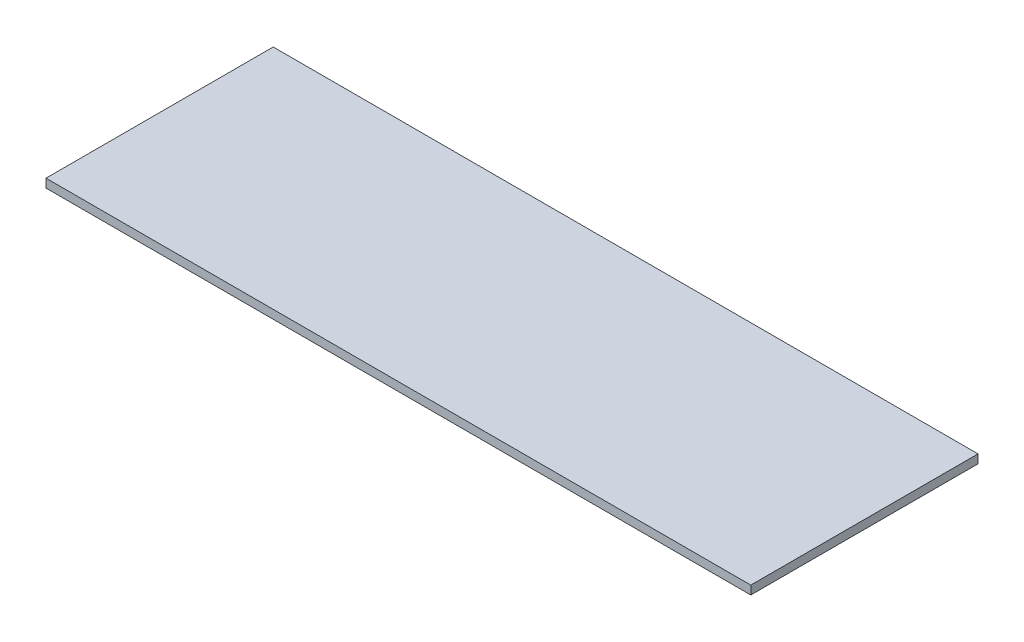
ISO-10303-21;
HEADER;
FILE_DESCRIPTION(('STEP AP214'),'2;1');
FILE_NAME('part.step','',(''),(''),'','','');
FILE_SCHEMA(('AUTOMOTIVE_DESIGN { 1 0 10303 214 1 1 1 1 }'));
ENDSEC;
DATA;
#1=APPLICATION_CONTEXT('core data for automotive mechanical design processes');
#2=APPLICATION_PROTOCOL_DEFINITION('international standard','automotive_design',2000,#1);
#3=PRODUCT_CONTEXT('',#1,'mechanical');
#4=PRODUCT('Part','Part','',(#3));
#5=PRODUCT_RELATED_PRODUCT_CATEGORY('part','',(#4));
#6=PRODUCT_DEFINITION_FORMATION('','',#4);
#7=PRODUCT_DEFINITION_CONTEXT('part definition',#1,'design');
#8=PRODUCT_DEFINITION('design','',#6,#7);
#9=PRODUCT_DEFINITION_SHAPE('','',#8);
#10=(LENGTH_UNIT() NAMED_UNIT(*) SI_UNIT(.MILLI.,.METRE.));
#11=(NAMED_UNIT(*) PLANE_ANGLE_UNIT() SI_UNIT($,.RADIAN.));
#12=(NAMED_UNIT(*) SI_UNIT($,.STERADIAN.) SOLID_ANGLE_UNIT());
#13=UNCERTAINTY_MEASURE_WITH_UNIT(LENGTH_MEASURE(1.E-05),#10,'distance_accuracy_value','');
#14=(GEOMETRIC_REPRESENTATION_CONTEXT(3) GLOBAL_UNCERTAINTY_ASSIGNED_CONTEXT((#13)) GLOBAL_UNIT_ASSIGNED_CONTEXT((#10,
#11,#12)) REPRESENTATION_CONTEXT('',''));
#15=CARTESIAN_POINT('',(0.,0.,0.));
#16=DIRECTION('',(0.,0.,1.));
#17=DIRECTION('',(1.,0.,0.));
#18=AXIS2_PLACEMENT_3D('',#15,#16,#17);
#19=CARTESIAN_POINT('',(167.5,4.09516548284806,-54.));
#20=DIRECTION('',(-1.,0.,0.));
#21=DIRECTION('',(0.,0.,1.));
#22=AXIS2_PLACEMENT_3D('',#19,#20,#21);
#23=PLANE('',#22);
#24=DIRECTION('',(0.,0.,-1.));
#25=VECTOR('',#24,1.);
#26=CARTESIAN_POINT('',(167.5,0.,-54.));
#27=LINE('',#26,#25);
#28=CARTESIAN_POINT('',(167.5,0.,54.));
#29=VERTEX_POINT('',#28);
#30=CARTESIAN_POINT('',(167.5,0.,-54.));
#31=VERTEX_POINT('',#30);
#32=EDGE_CURVE('E96',#29,#31,#27,.T.);
#33=ORIENTED_EDGE('',*,*,#32,.T.);
#34=DIRECTION('',(0.,-1.,0.));
#35=VECTOR('',#34,1.);
#36=CARTESIAN_POINT('',(167.5,4.09516548284806,-54.));
#37=LINE('',#36,#35);
#38=CARTESIAN_POINT('',(167.5,4.09516548284806,-54.));
#39=VERTEX_POINT('',#38);
#40=EDGE_CURVE('E11',#39,#31,#37,.T.);
#41=ORIENTED_EDGE('',*,*,#40,.F.);
#42=DIRECTION('',(0.,0.,-1.));
#43=VECTOR('',#42,1.);
#44=CARTESIAN_POINT('',(167.5,4.09516548284806,-54.));
#45=LINE('',#44,#43);
#46=CARTESIAN_POINT('',(167.5,4.09516548284806,54.));
#47=VERTEX_POINT('',#46);
#48=EDGE_CURVE('E84',#47,#39,#45,.T.);
#49=ORIENTED_EDGE('',*,*,#48,.F.);
#50=DIRECTION('',(0.,-1.,0.));
#51=VECTOR('',#50,1.);
#52=CARTESIAN_POINT('',(167.5,4.09516548284806,54.));
#53=LINE('',#52,#51);
#54=EDGE_CURVE('E92',#47,#29,#53,.T.);
#55=ORIENTED_EDGE('',*,*,#54,.T.);
#56=EDGE_LOOP('',(#33,#41,#49,#55));
#57=FACE_BOUND('',#56,.T.);
#58=ADVANCED_FACE('F33',(#57),#23,.F.);
#59=CARTESIAN_POINT('',(-167.5,4.09516548284806,-54.));
#60=DIRECTION('',(0.,0.,1.));
#61=DIRECTION('',(1.,0.,0.));
#62=AXIS2_PLACEMENT_3D('',#59,#60,#61);
#63=PLANE('',#62);
#64=DIRECTION('',(-1.,0.,0.));
#65=VECTOR('',#64,1.);
#66=CARTESIAN_POINT('',(-167.5,0.,-54.));
#67=LINE('',#66,#65);
#68=CARTESIAN_POINT('',(-167.5,0.,-54.));
#69=VERTEX_POINT('',#68);
#70=EDGE_CURVE('E88',#31,#69,#67,.T.);
#71=ORIENTED_EDGE('',*,*,#70,.T.);
#72=DIRECTION('',(0.,-1.,0.));
#73=VECTOR('',#72,1.);
#74=CARTESIAN_POINT('',(-167.5,4.09516548284806,-54.));
#75=LINE('',#74,#73);
#76=CARTESIAN_POINT('',(-167.5,4.09516548284806,-54.));
#77=VERTEX_POINT('',#76);
#78=EDGE_CURVE('E41',#77,#69,#75,.T.);
#79=ORIENTED_EDGE('',*,*,#78,.F.);
#80=DIRECTION('',(-1.,0.,0.));
#81=VECTOR('',#80,1.);
#82=CARTESIAN_POINT('',(-167.5,4.09516548284806,-54.));
#83=LINE('',#82,#81);
#84=EDGE_CURVE('E79',#39,#77,#83,.T.);
#85=ORIENTED_EDGE('',*,*,#84,.F.);
#86=ORIENTED_EDGE('',*,*,#40,.T.);
#87=EDGE_LOOP('',(#71,#79,#85,#86));
#88=FACE_BOUND('',#87,.T.);
#89=ADVANCED_FACE('F87',(#88),#63,.F.);
#90=CARTESIAN_POINT('',(-167.5,4.09516548284806,-54.));
#91=DIRECTION('',(1.,0.,0.));
#92=DIRECTION('',(0.,0.,-1.));
#93=AXIS2_PLACEMENT_3D('',#90,#91,#92);
#94=PLANE('',#93);
#95=DIRECTION('',(0.,0.,1.));
#96=VECTOR('',#95,1.);
#97=CARTESIAN_POINT('',(-167.5,0.,-54.));
#98=LINE('',#97,#96);
#99=CARTESIAN_POINT('',(-167.5,0.,54.));
#100=VERTEX_POINT('',#99);
#101=EDGE_CURVE('E66',#69,#100,#98,.T.);
#102=ORIENTED_EDGE('',*,*,#101,.T.);
#103=DIRECTION('',(0.,-1.,0.));
#104=VECTOR('',#103,1.);
#105=CARTESIAN_POINT('',(-167.5,4.09516548284806,54.));
#106=LINE('',#105,#104);
#107=CARTESIAN_POINT('',(-167.5,4.09516548284806,54.));
#108=VERTEX_POINT('',#107);
#109=EDGE_CURVE('E89',#108,#100,#106,.T.);
#110=ORIENTED_EDGE('',*,*,#109,.F.);
#111=DIRECTION('',(0.,0.,1.));
#112=VECTOR('',#111,1.);
#113=CARTESIAN_POINT('',(-167.5,4.09516548284806,-54.));
#114=LINE('',#113,#112);
#115=EDGE_CURVE('E82',#77,#108,#114,.T.);
#116=ORIENTED_EDGE('',*,*,#115,.F.);
#117=ORIENTED_EDGE('',*,*,#78,.T.);
#118=EDGE_LOOP('',(#102,#110,#116,#117));
#119=FACE_BOUND('',#118,.T.);
#120=ADVANCED_FACE('F90',(#119),#94,.F.);
#121=CARTESIAN_POINT('',(-167.5,4.09516548284806,54.));
#122=DIRECTION('',(0.,0.,-1.));
#123=DIRECTION('',(-1.,0.,0.));
#124=AXIS2_PLACEMENT_3D('',#121,#122,#123);
#125=PLANE('',#124);
#126=DIRECTION('',(1.,0.,0.));
#127=VECTOR('',#126,1.);
#128=CARTESIAN_POINT('',(-167.5,0.,54.));
#129=LINE('',#128,#127);
#130=EDGE_CURVE('E72',#100,#29,#129,.T.);
#131=ORIENTED_EDGE('',*,*,#130,.T.);
#132=ORIENTED_EDGE('',*,*,#54,.F.);
#133=DIRECTION('',(1.,0.,0.));
#134=VECTOR('',#133,1.);
#135=CARTESIAN_POINT('',(-167.5,4.09516548284806,54.));
#136=LINE('',#135,#134);
#137=EDGE_CURVE('E49',#108,#47,#136,.T.);
#138=ORIENTED_EDGE('',*,*,#137,.F.);
#139=ORIENTED_EDGE('',*,*,#109,.T.);
#140=EDGE_LOOP('',(#131,#132,#138,#139));
#141=FACE_BOUND('',#140,.T.);
#142=ADVANCED_FACE('F103',(#141),#125,.F.);
#143=CARTESIAN_POINT('',(0.,4.09516548284806,0.));
#144=DIRECTION('',(0.,1.,0.));
#145=DIRECTION('',(0.,0.,1.));
#146=AXIS2_PLACEMENT_3D('',#143,#144,#145);
#147=PLANE('',#146);
#148=ORIENTED_EDGE('',*,*,#48,.T.);
#149=ORIENTED_EDGE('',*,*,#84,.T.);
#150=ORIENTED_EDGE('',*,*,#115,.T.);
#151=ORIENTED_EDGE('',*,*,#137,.T.);
#152=EDGE_LOOP('',(#148,#149,#150,#151));
#153=FACE_BOUND('',#152,.T.);
#154=ADVANCED_FACE('F80',(#153),#147,.T.);
#155=CARTESIAN_POINT('',(0.,0.,0.));
#156=DIRECTION('',(0.,1.,0.));
#157=DIRECTION('',(0.,0.,1.));
#158=AXIS2_PLACEMENT_3D('',#155,#156,#157);
#159=PLANE('',#158);
#160=ORIENTED_EDGE('',*,*,#32,.F.);
#161=ORIENTED_EDGE('',*,*,#130,.F.);
#162=ORIENTED_EDGE('',*,*,#101,.F.);
#163=ORIENTED_EDGE('',*,*,#70,.F.);
#164=EDGE_LOOP('',(#160,#161,#162,#163));
#165=FACE_BOUND('',#164,.T.);
#166=ADVANCED_FACE('F106',(#165),#159,.F.);
#167=CLOSED_SHELL('',(#58,#89,#120,#142,#154,#166));
#168=MANIFOLD_SOLID_BREP('B2',#167);
#169=ADVANCED_BREP_SHAPE_REPRESENTATION('',(#18,#168),#14);
#170=SHAPE_DEFINITION_REPRESENTATION(#9,#169);
ENDSEC;
END-ISO-10303-21;
